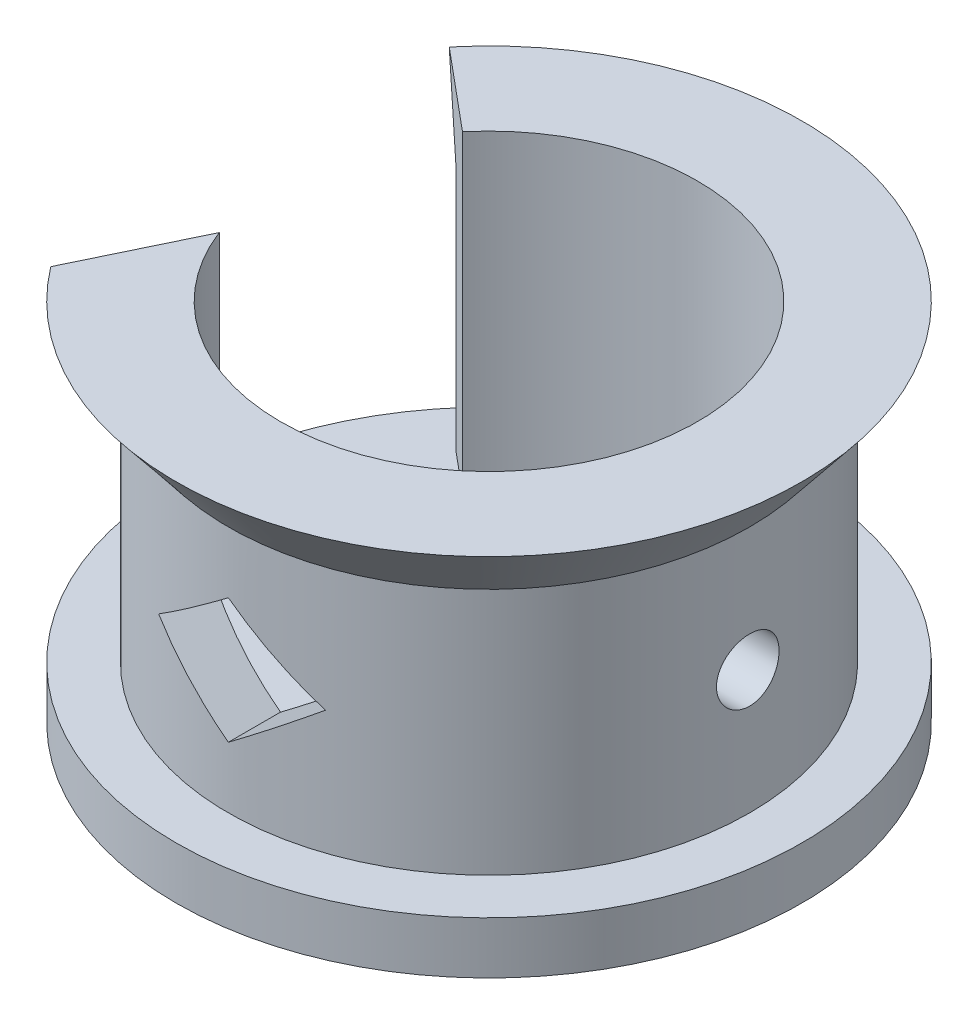
ISO-10303-21;
HEADER;
FILE_DESCRIPTION(('STEP AP214'),'2;1');
FILE_NAME('part.step','',(''),(''),'','','');
FILE_SCHEMA(('AUTOMOTIVE_DESIGN { 1 0 10303 214 1 1 1 1 }'));
ENDSEC;
DATA;
#1=APPLICATION_CONTEXT('core data for automotive mechanical design processes');
#2=APPLICATION_PROTOCOL_DEFINITION('international standard','automotive_design',2000,#1);
#3=PRODUCT_CONTEXT('',#1,'mechanical');
#4=PRODUCT('Part','Part','',(#3));
#5=PRODUCT_RELATED_PRODUCT_CATEGORY('part','',(#4));
#6=PRODUCT_DEFINITION_FORMATION('','',#4);
#7=PRODUCT_DEFINITION_CONTEXT('part definition',#1,'design');
#8=PRODUCT_DEFINITION('design','',#6,#7);
#9=PRODUCT_DEFINITION_SHAPE('','',#8);
#10=(LENGTH_UNIT() NAMED_UNIT(*) SI_UNIT(.MILLI.,.METRE.));
#11=(NAMED_UNIT(*) PLANE_ANGLE_UNIT() SI_UNIT($,.RADIAN.));
#12=(NAMED_UNIT(*) SI_UNIT($,.STERADIAN.) SOLID_ANGLE_UNIT());
#13=UNCERTAINTY_MEASURE_WITH_UNIT(LENGTH_MEASURE(1.E-05),#10,'distance_accuracy_value','');
#14=(GEOMETRIC_REPRESENTATION_CONTEXT(3) GLOBAL_UNCERTAINTY_ASSIGNED_CONTEXT((#13)) GLOBAL_UNIT_ASSIGNED_CONTEXT((#10,
#11,#12)) REPRESENTATION_CONTEXT('',''));
#15=CARTESIAN_POINT('',(0.,0.,0.));
#16=DIRECTION('',(0.,0.,1.));
#17=DIRECTION('',(1.,0.,0.));
#18=AXIS2_PLACEMENT_3D('',#15,#16,#17);
#19=CARTESIAN_POINT('',(0.,5.75,0.));
#20=DIRECTION('',(0.,-1.,0.));
#21=DIRECTION('',(0.,0.,-1.));
#22=AXIS2_PLACEMENT_3D('',#19,#20,#21);
#23=CYLINDRICAL_SURFACE('',#22,4.);
#24=CARTESIAN_POINT('',(0.,4.575,0.));
#25=DIRECTION('',(-0.6,0.8,0.));
#26=DIRECTION('',(-0.8,-0.6,0.));
#27=AXIS2_PLACEMENT_3D('',#24,#25,#26);
#28=ELLIPSE('',#27,5.,4.);
#29=CARTESIAN_POINT('',(-1.6,3.375,3.66606055596467));
#30=VERTEX_POINT('',#29);
#31=CARTESIAN_POINT('',(0.,4.575,4.));
#32=VERTEX_POINT('',#31);
#33=EDGE_CURVE('E244',#30,#32,#28,.T.);
#34=ORIENTED_EDGE('',*,*,#33,.F.);
#35=CARTESIAN_POINT('',(0.,2.175,0.));
#36=DIRECTION('',(0.6,0.8,0.));
#37=DIRECTION('',(0.8,-0.6,0.));
#38=AXIS2_PLACEMENT_3D('',#35,#36,#37);
#39=ELLIPSE('',#38,5.,4.);
#40=CARTESIAN_POINT('',(0.,2.175,4.));
#41=VERTEX_POINT('',#40);
#42=EDGE_CURVE('E254',#30,#41,#39,.T.);
#43=ORIENTED_EDGE('',*,*,#42,.T.);
#44=CARTESIAN_POINT('',(0.,2.175,0.));
#45=DIRECTION('',(-0.6,0.8,0.));
#46=DIRECTION('',(-0.8,-0.6,0.));
#47=AXIS2_PLACEMENT_3D('',#44,#45,#46);
#48=ELLIPSE('',#47,5.,4.);
#49=CARTESIAN_POINT('',(1.6,3.375,3.66606055596467));
#50=VERTEX_POINT('',#49);
#51=EDGE_CURVE('E243',#41,#50,#48,.T.);
#52=ORIENTED_EDGE('',*,*,#51,.T.);
#53=CARTESIAN_POINT('',(0.,4.575,0.));
#54=DIRECTION('',(0.6,0.8,0.));
#55=DIRECTION('',(0.8,-0.6,0.));
#56=AXIS2_PLACEMENT_3D('',#53,#54,#55);
#57=ELLIPSE('',#56,5.,4.);
#58=EDGE_CURVE('E235',#32,#50,#57,.T.);
#59=ORIENTED_EDGE('',*,*,#58,.F.);
#60=EDGE_LOOP('',(#34,#43,#52,#59));
#61=FACE_BOUND('',#60,.T.);
#62=CARTESIAN_POINT('',(3.95474398665704,3.375,0.6));
#63=CARTESIAN_POINT('',(3.95474454667437,3.34150177228402,0.599998616429137));
#64=CARTESIAN_POINT('',(3.9551742069564,3.30798409969972,0.597185185553963));
#65=CARTESIAN_POINT('',(3.95684525921296,3.24188587404675,0.586008786628003));
#66=CARTESIAN_POINT('',(3.95808744292572,3.209306267408,0.577640405610512));
#67=CARTESIAN_POINT('',(3.96123975594491,3.14605049782124,0.555610104392336));
#68=CARTESIAN_POINT('',(3.96314937252614,3.11537289498314,0.541952246725588));
#69=CARTESIAN_POINT('',(3.96742077645258,3.05674918769117,0.509740252351165));
#70=CARTESIAN_POINT('',(3.96978250153467,3.02880270791428,0.491186789719487));
#71=CARTESIAN_POINT('',(3.97471315699216,2.97620647329827,0.449551609674234));
#72=CARTESIAN_POINT('',(3.97728344983223,2.9515817546373,0.426438422339281));
#73=CARTESIAN_POINT('',(3.98232947267619,2.9065450057378,0.376407842177749));
#74=CARTESIAN_POINT('',(3.98480519747446,2.8861332071332,0.349490240314612));
#75=CARTESIAN_POINT('',(3.98939738971274,2.85000934732346,0.292454543221098));
#76=CARTESIAN_POINT('',(3.99151207374227,2.83432033987102,0.262321690946307));
#77=CARTESIAN_POINT('',(3.99512882698562,2.80823536047673,0.19981154004279));
#78=CARTESIAN_POINT('',(3.99663092856778,2.79783910886284,0.167434360108271));
#79=CARTESIAN_POINT('',(3.99884365919113,2.78271064458766,0.101612449236228));
#80=CARTESIAN_POINT('',(3.99956014354938,2.77793650944513,0.0681775537559468));
#81=CARTESIAN_POINT('',(4.00014097907834,2.77405762607004,0.000974081607791781));
#82=CARTESIAN_POINT('',(4.00000537761976,2.77495256267212,-0.0327944764062984));
#83=CARTESIAN_POINT('',(3.99890199864318,2.78235333510497,-0.0994206872802079));
#84=CARTESIAN_POINT('',(3.99794091060992,2.78881406871659,-0.132283476560003));
#85=CARTESIAN_POINT('',(3.9953020009114,2.80709224252903,-0.196453131657255));
#86=CARTESIAN_POINT('',(3.99362416079896,2.81890982060058,-0.227759957405393));
#87=CARTESIAN_POINT('',(3.98972877549282,2.84761239876684,-0.288065512308127));
#88=CARTESIAN_POINT('',(3.98750921406255,2.8645163860435,-0.317055068929439));
#89=CARTESIAN_POINT('',(3.98277775298168,2.90289807746799,-0.371803162860071));
#90=CARTESIAN_POINT('',(3.98026583409274,2.92437608268275,-0.397561487308694));
#91=CARTESIAN_POINT('',(3.97520063277051,2.97154737953064,-0.445381793089058));
#92=CARTESIAN_POINT('',(3.97264718649303,2.99728004878805,-0.467404931803787));
#93=CARTESIAN_POINT('',(3.96781081781409,3.05209643084949,-0.506826397355251));
#94=CARTESIAN_POINT('',(3.9655278970786,3.08118016428797,-0.524224695711996));
#95=CARTESIAN_POINT('',(3.96149110114742,3.14191358517626,-0.553907858138419));
#96=CARTESIAN_POINT('',(3.95973763938116,3.17356525346496,-0.566188729080326));
#97=CARTESIAN_POINT('',(3.95696561159624,3.23851410205896,-0.585249344835517));
#98=CARTESIAN_POINT('',(3.9559469937852,3.2718111662187,-0.592029477349304));
#99=CARTESIAN_POINT('',(3.95476980558011,3.33876003583099,-0.599842880346622));
#100=CARTESIAN_POINT('',(3.9546029952103,3.37240527528061,-0.600931213060209));
#101=CARTESIAN_POINT('',(3.95512643174861,3.43939767792694,-0.597476228079276));
#102=CARTESIAN_POINT('',(3.95581665206311,3.47274485034031,-0.592933085129209));
#103=CARTESIAN_POINT('',(3.95796880984581,3.53802392718625,-0.578390811811065));
#104=CARTESIAN_POINT('',(3.95942686593143,3.56996208197664,-0.568419114111284));
#105=CARTESIAN_POINT('',(3.96294720730307,3.63171363681944,-0.543331327788347));
#106=CARTESIAN_POINT('',(3.9650095224287,3.66152693185128,-0.528214985105556));
#107=CARTESIAN_POINT('',(3.96952542274825,3.71842930413402,-0.493134711981294));
#108=CARTESIAN_POINT('',(3.97198183711995,3.74549617891193,-0.473135138247065));
#109=CARTESIAN_POINT('',(3.97700063773342,3.79590914394952,-0.428905667348806));
#110=CARTESIAN_POINT('',(3.97956302996117,3.81925502367246,-0.404675530978718));
#111=CARTESIAN_POINT('',(3.98453082086955,3.86176104265343,-0.352430247851274));
#112=CARTESIAN_POINT('',(3.98693473384169,3.88088469129699,-0.324385250708783));
#113=CARTESIAN_POINT('',(3.99129162012806,3.91414916210506,-0.265448832105472));
#114=CARTESIAN_POINT('',(3.99324460577825,3.92829012058601,-0.234557488544175));
#115=CARTESIAN_POINT('',(3.99647307864318,3.95112949699521,-0.170919198344458));
#116=CARTESIAN_POINT('',(3.9977510468716,3.95984786683134,-0.138179543501721));
#117=CARTESIAN_POINT('',(3.99949590662759,3.97165915181499,-0.0716803262004772));
#118=CARTESIAN_POINT('',(3.99996285172321,3.97475243849966,-0.0379208312522323));
#119=CARTESIAN_POINT('',(4.00003251623657,3.97521668181976,0.0293058363443272));
#120=CARTESIAN_POINT('',(3.99964366809518,3.97264347235079,0.0627726280848205));
#121=CARTESIAN_POINT('',(3.99806244207656,3.9619674446317,0.128791918129243));
#122=CARTESIAN_POINT('',(3.99687006677066,3.95386464407658,0.161344419358605));
#123=CARTESIAN_POINT('',(3.99381514696985,3.93237924977191,0.224595749751864));
#124=CARTESIAN_POINT('',(3.99195309326779,3.91900052194443,0.255295917259513));
#125=CARTESIAN_POINT('',(3.987763337982,3.88734900480674,0.314024447158641));
#126=CARTESIAN_POINT('',(3.98543562128135,3.86907605660786,0.342052722768283));
#127=CARTESIAN_POINT('',(3.98054604254471,3.82795292046833,0.394925034076783));
#128=CARTESIAN_POINT('',(3.97798219370377,3.80506150967346,0.419736826578553));
#129=CARTESIAN_POINT('',(3.972924006756,3.75543797076781,0.465187233561071));
#130=CARTESIAN_POINT('',(3.97042968510516,3.72870494247026,0.485824867195935));
#131=CARTESIAN_POINT('',(3.96577793611646,3.67198040670699,0.522445243291897));
#132=CARTESIAN_POINT('',(3.96362248062794,3.64197143319127,0.538401177164836));
#133=CARTESIAN_POINT('',(3.95991563644289,3.57968128929468,0.565022455488181));
#134=CARTESIAN_POINT('',(3.95836362123172,3.54740251685687,0.57569329029959));
#135=CARTESIAN_POINT('',(3.9563979420993,3.49164902549741,0.589019807560105));
#136=CARTESIAN_POINT('',(3.95578099752952,3.46851864123029,0.593131079121681));
#137=CARTESIAN_POINT('',(3.95495382626805,3.42192868330626,0.598621642306297));
#138=CARTESIAN_POINT('',(3.95474359430462,3.39846911392016,0.600000969340303));
#139=CARTESIAN_POINT('',(3.95474398665704,3.375,0.6));
#140=B_SPLINE_CURVE_WITH_KNOTS('',3,(#62,#63,#64,#65,#66,#67,#68,#69,#70,#71,#72,#73,#74,#75,
#76,#77,#78,#79,#80,#81,#82,#83,#84,#85,#86,#87,#88,#89,#90,#91,#92,#93,#94,#95,#96,#97,#98,#99,
#100,#101,#102,#103,#104,#105,#106,#107,#108,#109,#110,#111,#112,#113,#114,#115,#116,#117,#118,
#119,#120,#121,#122,#123,#124,#125,#126,#127,#128,#129,#130,#131,#132,#133,#134,#135,#136,#137,
#138,#139),.UNSPECIFIED.,.T.,.F.,(4,2,2,2,2,2,2,2,2,2,2,2,2,2,2,2,2,2,2,2,2,2,2,2,2,2,2,2,2,2,2,
2,2,2,2,2,2,2,4),(0.,0.100408900721947,0.200915787824721,0.301345634134269,0.40176165946453,
0.50289663459643,0.604037168831268,0.705663688423128,0.807284837458002,0.908143330137587,
1.0089962157575,1.10903945006291,1.2090852593576,1.30950926554581,1.40993988379709,
1.51135817866508,1.6127770980574,1.71427500709255,1.81576576177736,1.91627285841497,
2.01677683639967,2.11677757922949,2.21678326114447,2.31754194400521,2.41830632584721,
2.51991015101406,2.62151119628742,2.72273616356436,2.82395444468189,2.92417985448931,
3.02440494357129,3.12455672903133,3.22471176626843,3.32580380004388,3.42691956094745,
3.52860351529973,3.63018161378225,3.70052976756645,3.77087700950477),.UNSPECIFIED.);
#141=CARTESIAN_POINT('',(3.95474398665704,3.375,0.6));
#142=VERTEX_POINT('',#141);
#143=EDGE_CURVE('E174',#142,#142,#140,.T.);
#144=ORIENTED_EDGE('',*,*,#143,.T.);
#145=EDGE_LOOP('',(#144));
#146=FACE_BOUND('',#145,.T.);
#147=CARTESIAN_POINT('',(0.,7.,0.));
#148=DIRECTION('',(0.,1.,0.));
#149=DIRECTION('',(0.,0.,1.));
#150=AXIS2_PLACEMENT_3D('',#147,#148,#149);
#151=CIRCLE('',#150,4.);
#152=CARTESIAN_POINT('',(-3.72991173047111,7.,1.44490777660515));
#153=VERTEX_POINT('',#152);
#154=CARTESIAN_POINT('',(-3.07122452518282,7.,-2.56272899775133));
#155=VERTEX_POINT('',#154);
#156=EDGE_CURVE('E258',#153,#155,#151,.T.);
#157=ORIENTED_EDGE('',*,*,#156,.T.);
#158=DIRECTION('',(0.,1.,0.));
#159=VECTOR('',#158,1.);
#160=CARTESIAN_POINT('',(-3.07122452518282,1.,-2.56272899775133));
#161=LINE('',#160,#159);
#162=CARTESIAN_POINT('',(-3.07122452518282,1.,-2.56272899775133));
#163=VERTEX_POINT('',#162);
#164=EDGE_CURVE('E127',#163,#155,#161,.T.);
#165=ORIENTED_EDGE('',*,*,#164,.F.);
#166=CARTESIAN_POINT('',(0.,1.,0.));
#167=DIRECTION('',(0.,1.,0.));
#168=DIRECTION('',(0.,0.,1.));
#169=AXIS2_PLACEMENT_3D('',#166,#167,#168);
#170=CIRCLE('',#169,4.);
#171=CARTESIAN_POINT('',(-3.72991173047111,1.,1.44490777660515));
#172=VERTEX_POINT('',#171);
#173=EDGE_CURVE('E135',#163,#172,#170,.F.);
#174=ORIENTED_EDGE('',*,*,#173,.T.);
#175=DIRECTION('',(0.,1.,0.));
#176=VECTOR('',#175,1.);
#177=CARTESIAN_POINT('',(-3.72991173047111,1.,1.44490777660515));
#178=LINE('',#177,#176);
#179=EDGE_CURVE('E116',#172,#153,#178,.T.);
#180=ORIENTED_EDGE('',*,*,#179,.T.);
#181=EDGE_LOOP('',(#157,#165,#174,#180));
#182=FACE_BOUND('',#181,.T.);
#183=ADVANCED_FACE('F45',(#61,#146,#182),#23,.F.);
#184=CARTESIAN_POINT('',(0.,5.75,0.));
#185=DIRECTION('',(0.,-1.,0.));
#186=DIRECTION('',(0.,0.,-1.));
#187=AXIS2_PLACEMENT_3D('',#184,#185,#186);
#188=CYLINDRICAL_SURFACE('',#187,5.);
#189=CARTESIAN_POINT('',(4.96386945839634,3.375,0.6));
#190=CARTESIAN_POINT('',(4.9638699235667,3.34142817176193,0.599998566345552));
#191=CARTESIAN_POINT('',(4.96421371576855,3.30783509597572,0.597172826992676));
#192=CARTESIAN_POINT('',(4.96555129020866,3.24158307759369,0.585944637419275));
#193=CARTESIAN_POINT('',(4.96654575971934,3.20892516086379,0.577536290478033));
#194=CARTESIAN_POINT('',(4.96907046210478,3.14551231889724,0.555393669231672));
#195=CARTESIAN_POINT('',(4.9706003397472,3.11475614777276,0.541662925579496));
#196=CARTESIAN_POINT('',(4.97402304999376,3.05599057157981,0.509272675115884));
#197=CARTESIAN_POINT('',(4.97591581835864,3.02798068168641,0.490614040424029));
#198=CARTESIAN_POINT('',(4.97986200109296,2.97535204567797,0.448794287860078));
#199=CARTESIAN_POINT('',(4.98191611633016,2.95074954113028,0.425612794501293));
#200=CARTESIAN_POINT('',(4.98594723170915,2.90577425636762,0.375449172869758));
#201=CARTESIAN_POINT('',(4.98792422807936,2.88540168281164,0.348466859010827));
#202=CARTESIAN_POINT('',(4.99158548046123,2.84940669341274,0.291365913693595));
#203=CARTESIAN_POINT('',(4.99326882761331,2.83379891685207,0.261237990769797));
#204=CARTESIAN_POINT('',(4.99614542486483,2.80787030792305,0.198765153454555));
#205=CARTESIAN_POINT('',(4.99733869178934,2.79754929405045,0.166420315217108));
#206=CARTESIAN_POINT('',(4.99909574649051,2.78253554877931,0.100597571397016));
#207=CARTESIAN_POINT('',(4.99966254728816,2.77781586931085,0.0671258942086757));
#208=CARTESIAN_POINT('',(5.00011308732203,2.7740552801379,-0.000138899333713211));
#209=CARTESIAN_POINT('',(4.99999685144069,2.77501416356836,-0.0339320039336681));
#210=CARTESIAN_POINT('',(4.99909685850532,2.78256182437027,-0.100697133503506));
#211=CARTESIAN_POINT('',(4.99831653768676,2.78912162099448,-0.133672487513643));
#212=CARTESIAN_POINT('',(4.99617992844761,2.8076396303432,-0.198050874018236));
#213=CARTESIAN_POINT('',(4.99482362980932,2.81959793883633,-0.229453878608521));
#214=CARTESIAN_POINT('',(4.99168155809107,2.8486045457813,-0.289886224651875));
#215=CARTESIAN_POINT('',(4.98989472377384,2.86566544720128,-0.318909459455077));
#216=CARTESIAN_POINT('',(4.98609161934322,2.90438377979123,-0.373691784039757));
#217=CARTESIAN_POINT('',(4.98407533953192,2.92604140528312,-0.399450735753378));
#218=CARTESIAN_POINT('',(4.98002413490592,2.97350086990809,-0.447143442246099));
#219=CARTESIAN_POINT('',(4.97798917265084,2.9993279562747,-0.469052077756758));
#220=CARTESIAN_POINT('',(4.97414252092149,3.0543063027359,-0.508227183650314));
#221=CARTESIAN_POINT('',(4.9723308320519,3.0834575718329,-0.525493641461051));
#222=CARTESIAN_POINT('',(4.96913584110431,3.14427849802948,-0.554895356717299));
#223=CARTESIAN_POINT('',(4.96775269869133,3.17594908825158,-0.567028702315283));
#224=CARTESIAN_POINT('',(4.96557456613223,3.24089847190024,-0.585798020064755));
#225=CARTESIAN_POINT('',(4.96477954993463,3.27417719402386,-0.592434235717102));
#226=CARTESIAN_POINT('',(4.96387240031274,3.34117661927534,-0.59998785742433));
#227=CARTESIAN_POINT('',(4.96375605121268,3.37489328717623,-0.600940568541544));
#228=CARTESIAN_POINT('',(4.96420826602292,3.44200575616859,-0.597193196111205));
#229=CARTESIAN_POINT('',(4.96477681650601,3.47540156353748,-0.592493223382497));
#230=CARTESIAN_POINT('',(4.96653092549957,3.5408191567196,-0.577603583884036));
#231=CARTESIAN_POINT('',(4.96771457204317,3.57284486936186,-0.567430924997875));
#232=CARTESIAN_POINT('',(4.97056395706497,3.63473585659519,-0.541902153585248));
#233=CARTESIAN_POINT('',(4.97222971121828,3.66460106090061,-0.526545872517223));
#234=CARTESIAN_POINT('',(4.97586574626598,3.72148325899492,-0.490998605443221));
#235=CARTESIAN_POINT('',(4.97783747219711,3.74848565737626,-0.470784414282952));
#236=CARTESIAN_POINT('',(4.98185871080738,3.79872702260236,-0.426128035673414));
#237=CARTESIAN_POINT('',(4.98390822626876,3.82196585468118,-0.40168569688724));
#238=CARTESIAN_POINT('',(4.98786701889821,3.86414394944698,-0.349112854533544));
#239=CARTESIAN_POINT('',(4.98977550512061,3.88306004930228,-0.320963699883566));
#240=CARTESIAN_POINT('',(4.9932254486232,3.91589564186582,-0.261867285882116));
#241=CARTESIAN_POINT('',(4.99476691280075,3.92981522847489,-0.230920079128883));
#242=CARTESIAN_POINT('',(4.99730560861028,3.95222420097516,-0.167183848943998));
#243=CARTESIAN_POINT('',(4.99830419405257,3.96072710397685,-0.134399634129437));
#244=CARTESIAN_POINT('',(4.99965022729014,3.97210534871643,-0.0678561169982956));
#245=CARTESIAN_POINT('',(4.99999770203132,3.97498092333863,-0.0340968550922521));
#246=CARTESIAN_POINT('',(5.00000226097294,3.97501876882246,0.033212001251132));
#247=CARTESIAN_POINT('',(4.99966366730498,3.97221680733664,0.0667615809317745));
#248=CARTESIAN_POINT('',(4.99834270804142,3.9610547090195,0.132909444959247));
#249=CARTESIAN_POINT('',(4.99736034265685,3.9526945740101,0.165507729617898));
#250=CARTESIAN_POINT('',(4.99486176038979,3.93066439697368,0.228823911196723));
#251=CARTESIAN_POINT('',(4.99334570158299,3.9169959271091,0.259542361749599));
#252=CARTESIAN_POINT('',(4.98994784886322,3.88474078608312,0.318255082105062));
#253=CARTESIAN_POINT('',(4.98806605199043,3.86615407511943,0.34624932985874));
#254=CARTESIAN_POINT('',(4.98413278724527,3.82445726359875,0.398901896849716));
#255=CARTESIAN_POINT('',(4.98208036352183,3.80132052893485,0.423539053575359));
#256=CARTESIAN_POINT('',(4.97804493729182,3.75123539256951,0.468595461424817));
#257=CARTESIAN_POINT('',(4.97606195138489,3.72428608709974,0.489013709626173));
#258=CARTESIAN_POINT('',(4.97238238415055,3.6672314127659,0.525114149457491));
#259=CARTESIAN_POINT('',(4.97068684912818,3.63711513434541,0.540779196400619));
#260=CARTESIAN_POINT('',(4.96778644753479,3.57467644924984,0.566807611647488));
#261=CARTESIAN_POINT('',(4.96658104327924,3.54235650576045,0.57717679285206));
#262=CARTESIAN_POINT('',(4.96509254473976,3.48738809217892,0.589814020147281));
#263=CARTESIAN_POINT('',(4.96463614619901,3.46508744960802,0.593628329883895));
#264=CARTESIAN_POINT('',(4.9640244474611,3.42019441357315,0.598721793819022));
#265=CARTESIAN_POINT('',(4.96386914522333,3.39760202208748,0.600000965198835));
#266=CARTESIAN_POINT('',(4.96386945839634,3.375,0.6));
#267=B_SPLINE_CURVE_WITH_KNOTS('',3,(#189,#190,#191,#192,#193,#194,#195,#196,#197,#198,#199,
#200,#201,#202,#203,#204,#205,#206,#207,#208,#209,#210,#211,#212,#213,#214,#215,#216,#217,#218,
#219,#220,#221,#222,#223,#224,#225,#226,#227,#228,#229,#230,#231,#232,#233,#234,#235,#236,#237,
#238,#239,#240,#241,#242,#243,#244,#245,#246,#247,#248,#249,#250,#251,#252,#253,#254,#255,#256,
#257,#258,#259,#260,#261,#262,#263,#264,#265,#266),.UNSPECIFIED.,.T.,.F.,(4,2,2,2,2,2,2,2,2,2,2,
2,2,2,2,2,2,2,2,2,2,2,2,2,2,2,2,2,2,2,2,2,2,2,2,2,2,2,4),(0.,0.100632922643844,
0.201372309927725,0.302044985008905,0.402699855344441,0.503819106641508,0.604943297094443,
0.706375123507079,0.807803467345789,0.908741834432208,1.00967652444525,1.11009209231738,
1.21050944161334,1.31117689071054,1.41184859627167,1.51315448881769,1.61446065572223,
1.71580452135318,1.81714389761633,1.91785310817259,2.018560344393,2.11895639793242,
2.21935571608811,2.32024450062123,2.42113689698587,2.52255785859056,2.62397691406367,
2.72514188068195,2.82630266054771,2.9268281237563,3.02735355401375,3.12784923446599,
3.2283457282335,3.32944900824762,3.43057629503645,3.53206412432329,3.63344031682385,
3.70119125785949,3.76894173972763),.UNSPECIFIED.);
#268=CARTESIAN_POINT('',(4.96386945839634,3.375,0.6));
#269=VERTEX_POINT('',#268);
#270=EDGE_CURVE('E165',#269,#269,#267,.T.);
#271=ORIENTED_EDGE('',*,*,#270,.F.);
#272=EDGE_LOOP('',(#271));
#273=FACE_BOUND('',#272,.T.);
#274=CARTESIAN_POINT('',(0.,2.175,0.));
#275=DIRECTION('',(0.6,0.8,0.));
#276=DIRECTION('',(0.8,-0.6,0.));
#277=AXIS2_PLACEMENT_3D('',#274,#275,#276);
#278=ELLIPSE('',#277,6.25,5.);
#279=CARTESIAN_POINT('',(-1.6,3.375,4.73708771293081));
#280=VERTEX_POINT('',#279);
#281=CARTESIAN_POINT('',(0.,2.175,5.));
#282=VERTEX_POINT('',#281);
#283=EDGE_CURVE('E162',#280,#282,#278,.T.);
#284=ORIENTED_EDGE('',*,*,#283,.F.);
#285=CARTESIAN_POINT('',(0.,4.575,0.));
#286=DIRECTION('',(-0.6,0.8,0.));
#287=DIRECTION('',(-0.8,-0.6,0.));
#288=AXIS2_PLACEMENT_3D('',#285,#286,#287);
#289=ELLIPSE('',#288,6.25,5.);
#290=CARTESIAN_POINT('',(0.,4.575,5.));
#291=VERTEX_POINT('',#290);
#292=EDGE_CURVE('E143',#280,#291,#289,.T.);
#293=ORIENTED_EDGE('',*,*,#292,.T.);
#294=CARTESIAN_POINT('',(0.,4.575,0.));
#295=DIRECTION('',(0.6,0.8,0.));
#296=DIRECTION('',(0.8,-0.6,0.));
#297=AXIS2_PLACEMENT_3D('',#294,#295,#296);
#298=ELLIPSE('',#297,6.25,5.);
#299=CARTESIAN_POINT('',(1.6,3.375,4.73708771293081));
#300=VERTEX_POINT('',#299);
#301=EDGE_CURVE('E149',#291,#300,#298,.T.);
#302=ORIENTED_EDGE('',*,*,#301,.T.);
#303=CARTESIAN_POINT('',(0.,2.175,0.));
#304=DIRECTION('',(-0.6,0.8,0.));
#305=DIRECTION('',(-0.8,-0.6,0.));
#306=AXIS2_PLACEMENT_3D('',#303,#304,#305);
#307=ELLIPSE('',#306,6.25,5.);
#308=EDGE_CURVE('E159',#282,#300,#307,.T.);
#309=ORIENTED_EDGE('',*,*,#308,.F.);
#310=EDGE_LOOP('',(#284,#293,#302,#309));
#311=FACE_BOUND('',#310,.T.);
#312=DIRECTION('',(0.,-1.,0.));
#313=VECTOR('',#312,1.);
#314=CARTESIAN_POINT('',(-3.83903065647853,5.75,-3.20341124718917));
#315=LINE('',#314,#313);
#316=CARTESIAN_POINT('',(-3.83903065647853,5.75,-3.20341124718917));
#317=VERTEX_POINT('',#316);
#318=CARTESIAN_POINT('',(-3.83903065647853,1.,-3.20341124718917));
#319=VERTEX_POINT('',#318);
#320=EDGE_CURVE('E175',#317,#319,#315,.T.);
#321=ORIENTED_EDGE('',*,*,#320,.F.);
#322=CARTESIAN_POINT('',(0.,5.75,0.));
#323=DIRECTION('',(0.,1.,0.));
#324=DIRECTION('',(0.,0.,1.));
#325=AXIS2_PLACEMENT_3D('',#322,#323,#324);
#326=CIRCLE('',#325,5.);
#327=CARTESIAN_POINT('',(-4.2788555518368,5.75,2.58677311848477));
#328=VERTEX_POINT('',#327);
#329=EDGE_CURVE('E268',#328,#317,#326,.T.);
#330=ORIENTED_EDGE('',*,*,#329,.F.);
#331=DIRECTION('',(0.,-1.,0.));
#332=VECTOR('',#331,1.);
#333=CARTESIAN_POINT('',(-4.2788555518368,5.75,2.58677311848477));
#334=LINE('',#333,#332);
#335=CARTESIAN_POINT('',(-4.2788555518368,1.,2.58677311848477));
#336=VERTEX_POINT('',#335);
#337=EDGE_CURVE('E62',#336,#328,#334,.F.);
#338=ORIENTED_EDGE('',*,*,#337,.F.);
#339=CARTESIAN_POINT('',(0.,1.,0.));
#340=DIRECTION('',(0.,1.,0.));
#341=DIRECTION('',(0.,0.,1.));
#342=AXIS2_PLACEMENT_3D('',#339,#340,#341);
#343=CIRCLE('',#342,5.);
#344=EDGE_CURVE('E137',#336,#319,#343,.T.);
#345=ORIENTED_EDGE('',*,*,#344,.T.);
#346=EDGE_LOOP('',(#321,#330,#338,#345));
#347=FACE_BOUND('',#346,.T.);
#348=ADVANCED_FACE('F182',(#273,#311,#347),#188,.T.);
#349=CARTESIAN_POINT('',(0.,7.,0.));
#350=DIRECTION('',(0.,1.,0.));
#351=DIRECTION('',(0.,0.,1.));
#352=AXIS2_PLACEMENT_3D('',#349,#350,#351);
#353=PLANE('',#352);
#354=CARTESIAN_POINT('',(0.,7.,0.));
#355=DIRECTION('',(0.,-1.,0.));
#356=DIRECTION('',(0.,0.,-1.));
#357=AXIS2_PLACEMENT_3D('',#354,#355,#356);
#358=CIRCLE('',#357,6.);
#359=CARTESIAN_POINT('',(-4.60683678777423,7.,-3.844093496627));
#360=VERTEX_POINT('',#359);
#361=CARTESIAN_POINT('',(-4.77920630861274,7.,3.62755938059134));
#362=VERTEX_POINT('',#361);
#363=EDGE_CURVE('E264',#360,#362,#358,.T.);
#364=ORIENTED_EDGE('',*,*,#363,.F.);
#365=DIRECTION('',(0.767806131295706,0.,0.640682249437833));
#366=VECTOR('',#365,1.);
#367=CARTESIAN_POINT('',(0.,7.,0.));
#368=LINE('',#367,#366);
#369=EDGE_CURVE('E283',#360,#155,#368,.T.);
#370=ORIENTED_EDGE('',*,*,#369,.T.);
#371=ORIENTED_EDGE('',*,*,#156,.F.);
#372=DIRECTION('',(-0.43327526529903,0.,0.901261640413069));
#373=VECTOR('',#372,1.);
#374=CARTESIAN_POINT('',(-2.46547653088157,7.,-1.18526069468201));
#375=LINE('',#374,#373);
#376=EDGE_CURVE('E121',#153,#362,#375,.T.);
#377=ORIENTED_EDGE('',*,*,#376,.T.);
#378=EDGE_LOOP('',(#364,#370,#371,#377));
#379=FACE_BOUND('',#378,.T.);
#380=ADVANCED_FACE('F210',(#379),#353,.T.);
#381=CARTESIAN_POINT('',(0.,5.75,0.));
#382=DIRECTION('',(0.,1.,0.));
#383=DIRECTION('',(0.,0.,1.));
#384=AXIS2_PLACEMENT_3D('',#381,#382,#383);
#385=CONICAL_SURFACE('',#384,5.,0.674740942223553);
#386=ORIENTED_EDGE('',*,*,#329,.T.);
#387=DIRECTION('',(0.47964468770235,-0.780868809443031,0.400231028279843));
#388=VECTOR('',#387,1.);
#389=CARTESIAN_POINT('',(0.,-0.5,0.));
#390=LINE('',#389,#388);
#391=EDGE_CURVE('E11',#317,#360,#390,.F.);
#392=ORIENTED_EDGE('',*,*,#391,.T.);
#393=ORIENTED_EDGE('',*,*,#363,.T.);
#394=CARTESIAN_POINT('',(-4.77928419918081,7.0002,3.62772140179765));
#395=CARTESIAN_POINT('',(-4.73819154268684,6.89469238706804,3.54224402063415));
#396=CARTESIAN_POINT('',(-4.69697560431713,6.78943939721768,3.45651019920168));
#397=CARTESIAN_POINT('',(-4.61425489325697,6.57955100465699,3.28444174822569));
#398=CARTESIAN_POINT('',(-4.57275013726104,6.47491556688595,3.19810715340865));
#399=CARTESIAN_POINT('',(-4.48940419389633,6.26635693445201,3.02473814840255));
#400=CARTESIAN_POINT('',(-4.44756300149128,6.16243375049448,2.93770372773745));
#401=CARTESIAN_POINT('',(-4.36348167929218,5.95543983074877,2.76280505143992));
#402=CARTESIAN_POINT('',(-4.32124152671454,5.85236914428273,2.67494074841504));
#403=CARTESIAN_POINT('',(-4.27877273242105,5.7498,2.58660084471688));
#404=B_SPLINE_CURVE_WITH_KNOTS('',3,(#394,#395,#396,#397,#398,#399,#400,#401,#402,#403),
.UNSPECIFIED.,.F.,.F.,(4,2,2,2,4),(0.,0.425608037228318,0.851191674083829,1.27678169361107,
1.70239616623693),.UNSPECIFIED.);
#405=EDGE_CURVE('E55',#362,#328,#404,.T.);
#406=ORIENTED_EDGE('',*,*,#405,.T.);
#407=EDGE_LOOP('',(#386,#392,#393,#406));
#408=FACE_BOUND('',#407,.T.);
#409=ADVANCED_FACE('F212',(#408),#385,.T.);
#410=CARTESIAN_POINT('',(0.,1.,0.));
#411=DIRECTION('',(0.,-1.,0.));
#412=DIRECTION('',(0.,0.,-1.));
#413=AXIS2_PLACEMENT_3D('',#410,#411,#412);
#414=CYLINDRICAL_SURFACE('',#413,6.);
#415=CARTESIAN_POINT('',(0.,1.,0.));
#416=DIRECTION('',(0.,1.,0.));
#417=DIRECTION('',(0.,0.,1.));
#418=AXIS2_PLACEMENT_3D('',#415,#416,#417);
#419=CIRCLE('',#418,6.);
#420=CARTESIAN_POINT('',(0.,1.,6.));
#421=VERTEX_POINT('',#420);
#422=EDGE_CURVE('E144',#421,#421,#419,.T.);
#423=ORIENTED_EDGE('',*,*,#422,.F.);
#424=EDGE_LOOP('',(#423));
#425=FACE_BOUND('',#424,.T.);
#426=CARTESIAN_POINT('',(0.,0.,0.));
#427=DIRECTION('',(0.,1.,0.));
#428=DIRECTION('',(0.,0.,1.));
#429=AXIS2_PLACEMENT_3D('',#426,#427,#428);
#430=CIRCLE('',#429,6.);
#431=CARTESIAN_POINT('',(0.,0.,6.));
#432=VERTEX_POINT('',#431);
#433=EDGE_CURVE('E152',#432,#432,#430,.T.);
#434=ORIENTED_EDGE('',*,*,#433,.T.);
#435=EDGE_LOOP('',(#434));
#436=FACE_BOUND('',#435,.T.);
#437=ADVANCED_FACE('F47',(#425,#436),#414,.T.);
#438=CARTESIAN_POINT('',(0.,1.,0.));
#439=DIRECTION('',(0.,1.,0.));
#440=DIRECTION('',(0.,0.,1.));
#441=AXIS2_PLACEMENT_3D('',#438,#439,#440);
#442=PLANE('',#441);
#443=CARTESIAN_POINT('',(0.,1.,0.));
#444=DIRECTION('',(0.,1.,0.));
#445=DIRECTION('',(0.,0.,1.));
#446=AXIS2_PLACEMENT_3D('',#443,#444,#445);
#447=CIRCLE('',#446,2.4);
#448=CARTESIAN_POINT('',(0.,1.,2.4));
#449=VERTEX_POINT('',#448);
#450=EDGE_CURVE('E289',#449,#449,#447,.T.);
#451=ORIENTED_EDGE('',*,*,#450,.F.);
#452=EDGE_LOOP('',(#451));
#453=FACE_BOUND('',#452,.T.);
#454=ORIENTED_EDGE('',*,*,#344,.F.);
#455=DIRECTION('',(-0.43327526529903,0.,0.901261640413069));
#456=VECTOR('',#455,1.);
#457=CARTESIAN_POINT('',(-2.46547653088157,1.,-1.18526069468201));
#458=LINE('',#457,#456);
#459=EDGE_CURVE('E119',#172,#336,#458,.T.);
#460=ORIENTED_EDGE('',*,*,#459,.F.);
#461=ORIENTED_EDGE('',*,*,#173,.F.);
#462=DIRECTION('',(0.767806131295706,0.,0.640682249437833));
#463=VECTOR('',#462,1.);
#464=CARTESIAN_POINT('',(0.,1.,0.));
#465=LINE('',#464,#463);
#466=EDGE_CURVE('E139',#319,#163,#465,.T.);
#467=ORIENTED_EDGE('',*,*,#466,.F.);
#468=EDGE_LOOP('',(#454,#460,#461,#467));
#469=FACE_BOUND('',#468,.T.);
#470=ORIENTED_EDGE('',*,*,#422,.T.);
#471=EDGE_LOOP('',(#470));
#472=FACE_BOUND('',#471,.T.);
#473=ADVANCED_FACE('F132',(#453,#469,#472),#442,.T.);
#474=CARTESIAN_POINT('',(0.,0.,0.));
#475=DIRECTION('',(0.,1.,0.));
#476=DIRECTION('',(0.,0.,1.));
#477=AXIS2_PLACEMENT_3D('',#474,#475,#476);
#478=PLANE('',#477);
#479=CARTESIAN_POINT('',(0.,0.,0.));
#480=DIRECTION('',(0.,1.,0.));
#481=DIRECTION('',(0.,0.,1.));
#482=AXIS2_PLACEMENT_3D('',#479,#480,#481);
#483=CIRCLE('',#482,2.4);
#484=CARTESIAN_POINT('',(0.,0.,2.4));
#485=VERTEX_POINT('',#484);
#486=EDGE_CURVE('E49',#485,#485,#483,.T.);
#487=ORIENTED_EDGE('',*,*,#486,.T.);
#488=EDGE_LOOP('',(#487));
#489=FACE_BOUND('',#488,.T.);
#490=ORIENTED_EDGE('',*,*,#433,.F.);
#491=EDGE_LOOP('',(#490));
#492=FACE_BOUND('',#491,.T.);
#493=ADVANCED_FACE('F222',(#489,#492),#478,.F.);
#494=CARTESIAN_POINT('',(1.044,1.392,10.));
#495=DIRECTION('',(0.6,0.8,0.));
#496=DIRECTION('',(-0.8,0.6,0.));
#497=AXIS2_PLACEMENT_3D('',#494,#495,#496);
#498=PLANE('',#497);
#499=DIRECTION('',(0.,0.,-1.));
#500=VECTOR('',#499,1.);
#501=CARTESIAN_POINT('',(-1.6,3.375,10.));
#502=LINE('',#501,#500);
#503=EDGE_CURVE('E70',#280,#30,#502,.T.);
#504=ORIENTED_EDGE('',*,*,#503,.F.);
#505=ORIENTED_EDGE('',*,*,#283,.T.);
#506=DIRECTION('',(0.,0.,-1.));
#507=VECTOR('',#506,1.);
#508=CARTESIAN_POINT('',(0.,2.175,10.));
#509=LINE('',#508,#507);
#510=EDGE_CURVE('E250',#282,#41,#509,.T.);
#511=ORIENTED_EDGE('',*,*,#510,.T.);
#512=ORIENTED_EDGE('',*,*,#42,.F.);
#513=EDGE_LOOP('',(#504,#505,#511,#512));
#514=FACE_BOUND('',#513,.T.);
#515=ADVANCED_FACE('F218',(#514),#498,.T.);
#516=CARTESIAN_POINT('',(-1.044,1.392,10.));
#517=DIRECTION('',(-0.6,0.8,0.));
#518=DIRECTION('',(-0.8,-0.6,0.));
#519=AXIS2_PLACEMENT_3D('',#516,#517,#518);
#520=PLANE('',#519);
#521=ORIENTED_EDGE('',*,*,#510,.F.);
#522=ORIENTED_EDGE('',*,*,#308,.T.);
#523=DIRECTION('',(0.,0.,-1.));
#524=VECTOR('',#523,1.);
#525=CARTESIAN_POINT('',(1.6,3.375,10.));
#526=LINE('',#525,#524);
#527=EDGE_CURVE('E238',#300,#50,#526,.T.);
#528=ORIENTED_EDGE('',*,*,#527,.T.);
#529=ORIENTED_EDGE('',*,*,#51,.F.);
#530=EDGE_LOOP('',(#521,#522,#528,#529));
#531=FACE_BOUND('',#530,.T.);
#532=ADVANCED_FACE('F221',(#531),#520,.T.);
#533=CARTESIAN_POINT('',(2.196,2.928,10.));
#534=DIRECTION('',(0.6,0.8,0.));
#535=DIRECTION('',(-0.8,0.6,0.));
#536=AXIS2_PLACEMENT_3D('',#533,#534,#535);
#537=PLANE('',#536);
#538=ORIENTED_EDGE('',*,*,#58,.T.);
#539=ORIENTED_EDGE('',*,*,#527,.F.);
#540=ORIENTED_EDGE('',*,*,#301,.F.);
#541=DIRECTION('',(0.,0.,-1.));
#542=VECTOR('',#541,1.);
#543=CARTESIAN_POINT('',(0.,4.575,10.));
#544=LINE('',#543,#542);
#545=EDGE_CURVE('E239',#291,#32,#544,.T.);
#546=ORIENTED_EDGE('',*,*,#545,.T.);
#547=EDGE_LOOP('',(#538,#539,#540,#546));
#548=FACE_BOUND('',#547,.T.);
#549=ADVANCED_FACE('F225',(#548),#537,.F.);
#550=CARTESIAN_POINT('',(-2.196,2.928,10.));
#551=DIRECTION('',(-0.6,0.8,0.));
#552=DIRECTION('',(-0.8,-0.6,0.));
#553=AXIS2_PLACEMENT_3D('',#550,#551,#552);
#554=PLANE('',#553);
#555=ORIENTED_EDGE('',*,*,#33,.T.);
#556=ORIENTED_EDGE('',*,*,#545,.F.);
#557=ORIENTED_EDGE('',*,*,#292,.F.);
#558=ORIENTED_EDGE('',*,*,#503,.T.);
#559=EDGE_LOOP('',(#555,#556,#557,#558));
#560=FACE_BOUND('',#559,.T.);
#561=ADVANCED_FACE('F192',(#560),#554,.F.);
#562=CARTESIAN_POINT('',(10.,3.375,0.));
#563=DIRECTION('',(-1.,0.,0.));
#564=DIRECTION('',(0.,0.,1.));
#565=AXIS2_PLACEMENT_3D('',#562,#563,#564);
#566=CYLINDRICAL_SURFACE('',#565,0.6);
#567=ORIENTED_EDGE('',*,*,#143,.F.);
#568=EDGE_LOOP('',(#567));
#569=FACE_BOUND('',#568,.T.);
#570=ORIENTED_EDGE('',*,*,#270,.T.);
#571=EDGE_LOOP('',(#570));
#572=FACE_BOUND('',#571,.T.);
#573=ADVANCED_FACE('F186',(#569,#572),#566,.F.);
#574=CARTESIAN_POINT('',(0.,1.,0.));
#575=DIRECTION('',(-0.640682249437833,0.,0.767806131295706));
#576=DIRECTION('',(0.767806131295706,0.,0.640682249437833));
#577=AXIS2_PLACEMENT_3D('',#574,#575,#576);
#578=PLANE('',#577);
#579=ORIENTED_EDGE('',*,*,#320,.T.);
#580=ORIENTED_EDGE('',*,*,#466,.T.);
#581=ORIENTED_EDGE('',*,*,#164,.T.);
#582=ORIENTED_EDGE('',*,*,#369,.F.);
#583=ORIENTED_EDGE('',*,*,#391,.F.);
#584=EDGE_LOOP('',(#579,#580,#581,#582,#583));
#585=FACE_BOUND('',#584,.T.);
#586=ADVANCED_FACE('F191',(#585),#578,.T.);
#587=CARTESIAN_POINT('',(-2.46547653088157,1.,-1.18526069468201));
#588=DIRECTION('',(-0.901261640413069,0.,-0.43327526529903));
#589=DIRECTION('',(-0.43327526529903,0.,0.901261640413069));
#590=AXIS2_PLACEMENT_3D('',#587,#588,#589);
#591=PLANE('',#590);
#592=ORIENTED_EDGE('',*,*,#337,.T.);
#593=ORIENTED_EDGE('',*,*,#405,.F.);
#594=ORIENTED_EDGE('',*,*,#376,.F.);
#595=ORIENTED_EDGE('',*,*,#179,.F.);
#596=ORIENTED_EDGE('',*,*,#459,.T.);
#597=EDGE_LOOP('',(#592,#593,#594,#595,#596));
#598=FACE_BOUND('',#597,.T.);
#599=ADVANCED_FACE('F118',(#598),#591,.T.);
#600=CARTESIAN_POINT('',(0.,-5.,0.));
#601=DIRECTION('',(0.,1.,0.));
#602=DIRECTION('',(0.,0.,1.));
#603=AXIS2_PLACEMENT_3D('',#600,#601,#602);
#604=CYLINDRICAL_SURFACE('',#603,2.4);
#605=ORIENTED_EDGE('',*,*,#450,.T.);
#606=EDGE_LOOP('',(#605));
#607=FACE_BOUND('',#606,.T.);
#608=ORIENTED_EDGE('',*,*,#486,.F.);
#609=EDGE_LOOP('',(#608));
#610=FACE_BOUND('',#609,.T.);
#611=ADVANCED_FACE('F300',(#607,#610),#604,.F.);
#612=CLOSED_SHELL('',(#183,#348,#380,#409,#437,#473,#493,#515,#532,#549,#561,#573,#586,#599,#611));
#613=MANIFOLD_SOLID_BREP('B2',#612);
#614=ADVANCED_BREP_SHAPE_REPRESENTATION('',(#18,#613),#14);
#615=SHAPE_DEFINITION_REPRESENTATION(#9,#614);
ENDSEC;
END-ISO-10303-21;
